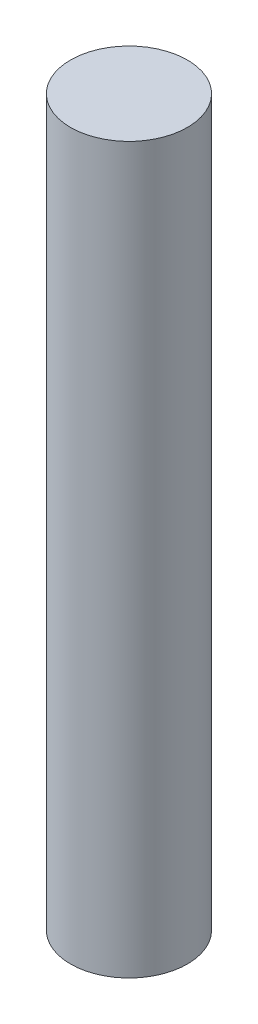
ISO-10303-21;
HEADER;
FILE_DESCRIPTION(('STEP AP214'),'2;1');
FILE_NAME('part.step','',(''),(''),'','','');
FILE_SCHEMA(('AUTOMOTIVE_DESIGN { 1 0 10303 214 1 1 1 1 }'));
ENDSEC;
DATA;
#1=APPLICATION_CONTEXT('core data for automotive mechanical design processes');
#2=APPLICATION_PROTOCOL_DEFINITION('international standard','automotive_design',2000,#1);
#3=PRODUCT_CONTEXT('',#1,'mechanical');
#4=PRODUCT('Part','Part','',(#3));
#5=PRODUCT_RELATED_PRODUCT_CATEGORY('part','',(#4));
#6=PRODUCT_DEFINITION_FORMATION('','',#4);
#7=PRODUCT_DEFINITION_CONTEXT('part definition',#1,'design');
#8=PRODUCT_DEFINITION('design','',#6,#7);
#9=PRODUCT_DEFINITION_SHAPE('','',#8);
#10=(LENGTH_UNIT() NAMED_UNIT(*) SI_UNIT(.MILLI.,.METRE.));
#11=(NAMED_UNIT(*) PLANE_ANGLE_UNIT() SI_UNIT($,.RADIAN.));
#12=(NAMED_UNIT(*) SI_UNIT($,.STERADIAN.) SOLID_ANGLE_UNIT());
#13=UNCERTAINTY_MEASURE_WITH_UNIT(LENGTH_MEASURE(1.E-05),#10,'distance_accuracy_value','');
#14=(GEOMETRIC_REPRESENTATION_CONTEXT(3) GLOBAL_UNCERTAINTY_ASSIGNED_CONTEXT((#13)) GLOBAL_UNIT_ASSIGNED_CONTEXT((#10,
#11,#12)) REPRESENTATION_CONTEXT('',''));
#15=CARTESIAN_POINT('',(0.,0.,0.));
#16=DIRECTION('',(0.,0.,1.));
#17=DIRECTION('',(1.,0.,0.));
#18=AXIS2_PLACEMENT_3D('',#15,#16,#17);
#19=CARTESIAN_POINT('',(0.,31.,0.));
#20=DIRECTION('',(0.,-1.,0.));
#21=DIRECTION('',(0.,0.,-1.));
#22=AXIS2_PLACEMENT_3D('',#19,#20,#21);
#23=CYLINDRICAL_SURFACE('',#22,2.5);
#24=CARTESIAN_POINT('',(0.,31.,0.));
#25=DIRECTION('',(0.,1.,0.));
#26=DIRECTION('',(0.,0.,1.));
#27=AXIS2_PLACEMENT_3D('',#24,#25,#26);
#28=CIRCLE('',#27,2.5);
#29=CARTESIAN_POINT('',(0.,31.,2.5));
#30=VERTEX_POINT('',#29);
#31=EDGE_CURVE('E10',#30,#30,#28,.T.);
#32=ORIENTED_EDGE('',*,*,#31,.F.);
#33=EDGE_LOOP('',(#32));
#34=FACE_BOUND('',#33,.T.);
#35=CARTESIAN_POINT('',(0.,0.,0.));
#36=DIRECTION('',(0.,1.,0.));
#37=DIRECTION('',(0.,0.,1.));
#38=AXIS2_PLACEMENT_3D('',#35,#36,#37);
#39=CIRCLE('',#38,2.5);
#40=CARTESIAN_POINT('',(0.,0.,2.5));
#41=VERTEX_POINT('',#40);
#42=EDGE_CURVE('E36',#41,#41,#39,.T.);
#43=ORIENTED_EDGE('',*,*,#42,.T.);
#44=EDGE_LOOP('',(#43));
#45=FACE_BOUND('',#44,.T.);
#46=ADVANCED_FACE('F34',(#34,#45),#23,.T.);
#47=CARTESIAN_POINT('',(0.,31.,0.));
#48=DIRECTION('',(0.,1.,0.));
#49=DIRECTION('',(0.,0.,1.));
#50=AXIS2_PLACEMENT_3D('',#47,#48,#49);
#51=PLANE('',#50);
#52=ORIENTED_EDGE('',*,*,#31,.T.);
#53=EDGE_LOOP('',(#52));
#54=FACE_BOUND('',#53,.T.);
#55=ADVANCED_FACE('F49',(#54),#51,.T.);
#56=CARTESIAN_POINT('',(0.,0.,0.));
#57=DIRECTION('',(0.,1.,0.));
#58=DIRECTION('',(0.,0.,1.));
#59=AXIS2_PLACEMENT_3D('',#56,#57,#58);
#60=PLANE('',#59);
#61=ORIENTED_EDGE('',*,*,#42,.F.);
#62=EDGE_LOOP('',(#61));
#63=FACE_BOUND('',#62,.T.);
#64=ADVANCED_FACE('F48',(#63),#60,.F.);
#65=CLOSED_SHELL('',(#46,#55,#64));
#66=MANIFOLD_SOLID_BREP('B2',#65);
#67=ADVANCED_BREP_SHAPE_REPRESENTATION('',(#18,#66),#14);
#68=SHAPE_DEFINITION_REPRESENTATION(#9,#67);
ENDSEC;
END-ISO-10303-21;
